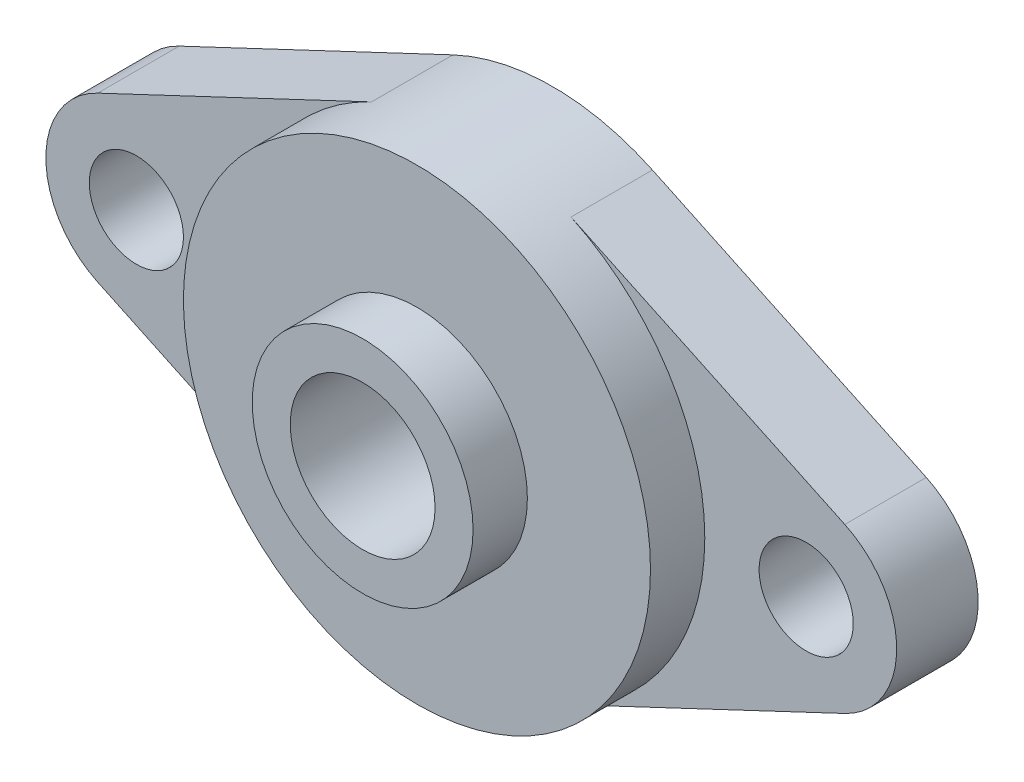
ISO-10303-21;
HEADER;
FILE_DESCRIPTION(('STEP AP214'),'2;1');
FILE_NAME('part.step','',(''),(''),'','','');
FILE_SCHEMA(('AUTOMOTIVE_DESIGN { 1 0 10303 214 1 1 1 1 }'));
ENDSEC;
DATA;
#1=APPLICATION_CONTEXT('core data for automotive mechanical design processes');
#2=APPLICATION_PROTOCOL_DEFINITION('international standard','automotive_design',2000,#1);
#3=PRODUCT_CONTEXT('',#1,'mechanical');
#4=PRODUCT('Part','Part','',(#3));
#5=PRODUCT_RELATED_PRODUCT_CATEGORY('part','',(#4));
#6=PRODUCT_DEFINITION_FORMATION('','',#4);
#7=PRODUCT_DEFINITION_CONTEXT('part definition',#1,'design');
#8=PRODUCT_DEFINITION('design','',#6,#7);
#9=PRODUCT_DEFINITION_SHAPE('','',#8);
#10=(LENGTH_UNIT() NAMED_UNIT(*) SI_UNIT(.MILLI.,.METRE.));
#11=(NAMED_UNIT(*) PLANE_ANGLE_UNIT() SI_UNIT($,.RADIAN.));
#12=(NAMED_UNIT(*) SI_UNIT($,.STERADIAN.) SOLID_ANGLE_UNIT());
#13=UNCERTAINTY_MEASURE_WITH_UNIT(LENGTH_MEASURE(1.E-05),#10,'distance_accuracy_value','');
#14=(GEOMETRIC_REPRESENTATION_CONTEXT(3) GLOBAL_UNCERTAINTY_ASSIGNED_CONTEXT((#13)) GLOBAL_UNIT_ASSIGNED_CONTEXT((#10,
#11,#12)) REPRESENTATION_CONTEXT('',''));
#15=CARTESIAN_POINT('',(0.,0.,0.));
#16=DIRECTION('',(0.,0.,1.));
#17=DIRECTION('',(1.,0.,0.));
#18=AXIS2_PLACEMENT_3D('',#15,#16,#17);
#19=CARTESIAN_POINT('',(0.,0.,4.5));
#20=DIRECTION('',(0.,0.,1.));
#21=DIRECTION('',(1.,0.,0.));
#22=AXIS2_PLACEMENT_3D('',#19,#20,#21);
#23=PLANE('',#22);
#24=CARTESIAN_POINT('',(0.,0.,4.5));
#25=DIRECTION('',(0.,0.,1.));
#26=DIRECTION('',(1.,0.,0.));
#27=AXIS2_PLACEMENT_3D('',#24,#25,#26);
#28=CIRCLE('',#27,12.9);
#29=CARTESIAN_POINT('',(-5.50864864864865,11.6646813100805,4.5));
#30=VERTEX_POINT('',#29);
#31=CARTESIAN_POINT('',(-5.50864864864865,-11.6646813100805,4.5));
#32=VERTEX_POINT('',#31);
#33=EDGE_CURVE('E51',#30,#32,#28,.T.);
#34=ORIENTED_EDGE('',*,*,#33,.F.);
#35=DIRECTION('',(-0.904238861246551,-0.427027027027027,0.));
#36=VECTOR('',#35,1.);
#37=CARTESIAN_POINT('',(-20.6351351351351,4.52119430623275,4.5));
#38=LINE('',#37,#36);
#39=CARTESIAN_POINT('',(-20.6351351351351,4.52119430623275,4.5));
#40=VERTEX_POINT('',#39);
#41=EDGE_CURVE('E163',#30,#40,#38,.T.);
#42=ORIENTED_EDGE('',*,*,#41,.T.);
#43=CARTESIAN_POINT('',(-18.5,0.,4.5));
#44=DIRECTION('',(0.,0.,1.));
#45=DIRECTION('',(1.,0.,0.));
#46=AXIS2_PLACEMENT_3D('',#43,#44,#45);
#47=CIRCLE('',#46,5.);
#48=CARTESIAN_POINT('',(-20.6351351351351,-4.52119430623275,4.5));
#49=VERTEX_POINT('',#48);
#50=EDGE_CURVE('E142',#40,#49,#47,.T.);
#51=ORIENTED_EDGE('',*,*,#50,.T.);
#52=DIRECTION('',(0.904238861246551,-0.427027027027027,0.));
#53=VECTOR('',#52,1.);
#54=CARTESIAN_POINT('',(-20.6351351351351,-4.52119430623275,4.5));
#55=LINE('',#54,#53);
#56=EDGE_CURVE('E139',#49,#32,#55,.T.);
#57=ORIENTED_EDGE('',*,*,#56,.T.);
#58=EDGE_LOOP('',(#34,#42,#51,#57));
#59=FACE_BOUND('',#58,.T.);
#60=CARTESIAN_POINT('',(-18.5,0.,4.5));
#61=DIRECTION('',(0.,0.,1.));
#62=DIRECTION('',(1.,0.,0.));
#63=AXIS2_PLACEMENT_3D('',#60,#61,#62);
#64=CIRCLE('',#63,2.6);
#65=CARTESIAN_POINT('',(-15.9,0.,4.5));
#66=VERTEX_POINT('',#65);
#67=EDGE_CURVE('E197',#66,#66,#64,.T.);
#68=ORIENTED_EDGE('',*,*,#67,.F.);
#69=EDGE_LOOP('',(#68));
#70=FACE_BOUND('',#69,.T.);
#71=ADVANCED_FACE('F41',(#59,#70),#23,.T.);
#72=CARTESIAN_POINT('',(5.50864864864865,-11.6646813100805,4.5));
#73=VERTEX_POINT('',#72);
#74=CARTESIAN_POINT('',(5.50864864864865,11.6646813100805,4.5));
#75=VERTEX_POINT('',#74);
#76=EDGE_CURVE('E115',#73,#75,#28,.T.);
#77=ORIENTED_EDGE('',*,*,#76,.F.);
#78=DIRECTION('',(0.904238861246551,0.427027027027027,0.));
#79=VECTOR('',#78,1.);
#80=CARTESIAN_POINT('',(20.6351351351351,-4.52119430623275,4.5));
#81=LINE('',#80,#79);
#82=CARTESIAN_POINT('',(20.6351351351351,-4.52119430623275,4.5));
#83=VERTEX_POINT('',#82);
#84=EDGE_CURVE('E120',#73,#83,#81,.T.);
#85=ORIENTED_EDGE('',*,*,#84,.T.);
#86=CARTESIAN_POINT('',(18.5,0.,4.5));
#87=DIRECTION('',(0.,0.,1.));
#88=DIRECTION('',(1.,0.,0.));
#89=AXIS2_PLACEMENT_3D('',#86,#87,#88);
#90=CIRCLE('',#89,5.);
#91=CARTESIAN_POINT('',(20.6351351351351,4.52119430623276,4.5));
#92=VERTEX_POINT('',#91);
#93=EDGE_CURVE('E60',#83,#92,#90,.T.);
#94=ORIENTED_EDGE('',*,*,#93,.T.);
#95=DIRECTION('',(-0.904238861246551,0.427027027027027,0.));
#96=VECTOR('',#95,1.);
#97=CARTESIAN_POINT('',(5.50864864864865,11.6646813100805,4.5));
#98=LINE('',#97,#96);
#99=EDGE_CURVE('E123',#92,#75,#98,.T.);
#100=ORIENTED_EDGE('',*,*,#99,.T.);
#101=EDGE_LOOP('',(#77,#85,#94,#100));
#102=FACE_BOUND('',#101,.T.);
#103=CARTESIAN_POINT('',(18.5,0.,4.5));
#104=DIRECTION('',(0.,0.,1.));
#105=DIRECTION('',(1.,0.,0.));
#106=AXIS2_PLACEMENT_3D('',#103,#104,#105);
#107=CIRCLE('',#106,2.6);
#108=CARTESIAN_POINT('',(21.1,0.,4.5));
#109=VERTEX_POINT('',#108);
#110=EDGE_CURVE('E152',#109,#109,#107,.T.);
#111=ORIENTED_EDGE('',*,*,#110,.F.);
#112=EDGE_LOOP('',(#111));
#113=FACE_BOUND('',#112,.T.);
#114=ADVANCED_FACE('F117',(#102,#113),#23,.T.);
#115=CARTESIAN_POINT('',(0.,0.,0.));
#116=DIRECTION('',(0.,0.,1.));
#117=DIRECTION('',(1.,0.,0.));
#118=AXIS2_PLACEMENT_3D('',#115,#116,#117);
#119=PLANE('',#118);
#120=CARTESIAN_POINT('',(0.,0.,0.));
#121=DIRECTION('',(0.,0.,1.));
#122=DIRECTION('',(1.,0.,0.));
#123=AXIS2_PLACEMENT_3D('',#120,#121,#122);
#124=CIRCLE('',#123,4.);
#125=CARTESIAN_POINT('',(4.,0.,0.));
#126=VERTEX_POINT('',#125);
#127=EDGE_CURVE('E214',#126,#126,#124,.T.);
#128=ORIENTED_EDGE('',*,*,#127,.T.);
#129=EDGE_LOOP('',(#128));
#130=FACE_BOUND('',#129,.T.);
#131=CARTESIAN_POINT('',(0.,0.,0.));
#132=DIRECTION('',(0.,0.,1.));
#133=DIRECTION('',(1.,0.,0.));
#134=AXIS2_PLACEMENT_3D('',#131,#132,#133);
#135=CIRCLE('',#134,12.9);
#136=CARTESIAN_POINT('',(5.50864864864865,11.6646813100805,0.));
#137=VERTEX_POINT('',#136);
#138=CARTESIAN_POINT('',(-5.50864864864865,11.6646813100805,0.));
#139=VERTEX_POINT('',#138);
#140=EDGE_CURVE('E148',#137,#139,#135,.T.);
#141=ORIENTED_EDGE('',*,*,#140,.F.);
#142=DIRECTION('',(-0.904238861246551,0.427027027027027,0.));
#143=VECTOR('',#142,1.);
#144=CARTESIAN_POINT('',(5.50864864864865,11.6646813100805,0.));
#145=LINE('',#144,#143);
#146=CARTESIAN_POINT('',(20.6351351351351,4.52119430623276,0.));
#147=VERTEX_POINT('',#146);
#148=EDGE_CURVE('E96',#147,#137,#145,.T.);
#149=ORIENTED_EDGE('',*,*,#148,.F.);
#150=CARTESIAN_POINT('',(18.5,0.,0.));
#151=DIRECTION('',(0.,0.,1.));
#152=DIRECTION('',(1.,0.,0.));
#153=AXIS2_PLACEMENT_3D('',#150,#151,#152);
#154=CIRCLE('',#153,5.);
#155=CARTESIAN_POINT('',(20.6351351351351,-4.52119430623275,0.));
#156=VERTEX_POINT('',#155);
#157=EDGE_CURVE('E89',#156,#147,#154,.T.);
#158=ORIENTED_EDGE('',*,*,#157,.F.);
#159=DIRECTION('',(0.904238861246551,0.427027027027027,0.));
#160=VECTOR('',#159,1.);
#161=CARTESIAN_POINT('',(20.6351351351351,-4.52119430623275,0.));
#162=LINE('',#161,#160);
#163=CARTESIAN_POINT('',(5.50864864864865,-11.6646813100805,0.));
#164=VERTEX_POINT('',#163);
#165=EDGE_CURVE('E159',#164,#156,#162,.T.);
#166=ORIENTED_EDGE('',*,*,#165,.F.);
#167=CARTESIAN_POINT('',(0.,0.,0.));
#168=DIRECTION('',(0.,0.,1.));
#169=DIRECTION('',(1.,0.,0.));
#170=AXIS2_PLACEMENT_3D('',#167,#168,#169);
#171=CIRCLE('',#170,12.9);
#172=CARTESIAN_POINT('',(-5.50864864864865,-11.6646813100805,0.));
#173=VERTEX_POINT('',#172);
#174=EDGE_CURVE('E132',#173,#164,#171,.T.);
#175=ORIENTED_EDGE('',*,*,#174,.F.);
#176=DIRECTION('',(0.904238861246551,-0.427027027027027,0.));
#177=VECTOR('',#176,1.);
#178=CARTESIAN_POINT('',(-20.6351351351351,-4.52119430623275,0.));
#179=LINE('',#178,#177);
#180=CARTESIAN_POINT('',(-20.6351351351351,-4.52119430623275,0.));
#181=VERTEX_POINT('',#180);
#182=EDGE_CURVE('E156',#181,#173,#179,.T.);
#183=ORIENTED_EDGE('',*,*,#182,.F.);
#184=CARTESIAN_POINT('',(-18.5,0.,0.));
#185=DIRECTION('',(0.,0.,1.));
#186=DIRECTION('',(1.,0.,0.));
#187=AXIS2_PLACEMENT_3D('',#184,#185,#186);
#188=CIRCLE('',#187,5.);
#189=CARTESIAN_POINT('',(-20.6351351351351,4.52119430623275,0.));
#190=VERTEX_POINT('',#189);
#191=EDGE_CURVE('E154',#190,#181,#188,.T.);
#192=ORIENTED_EDGE('',*,*,#191,.F.);
#193=DIRECTION('',(-0.904238861246551,-0.427027027027027,0.));
#194=VECTOR('',#193,1.);
#195=CARTESIAN_POINT('',(-20.6351351351351,4.52119430623275,0.));
#196=LINE('',#195,#194);
#197=EDGE_CURVE('E151',#139,#190,#196,.T.);
#198=ORIENTED_EDGE('',*,*,#197,.F.);
#199=EDGE_LOOP('',(#141,#149,#158,#166,#175,#183,#192,#198));
#200=FACE_BOUND('',#199,.T.);
#201=CARTESIAN_POINT('',(18.5,0.,0.));
#202=DIRECTION('',(0.,0.,1.));
#203=DIRECTION('',(1.,0.,0.));
#204=AXIS2_PLACEMENT_3D('',#201,#202,#203);
#205=CIRCLE('',#204,2.6);
#206=CARTESIAN_POINT('',(21.1,0.,0.));
#207=VERTEX_POINT('',#206);
#208=EDGE_CURVE('E194',#207,#207,#205,.T.);
#209=ORIENTED_EDGE('',*,*,#208,.T.);
#210=EDGE_LOOP('',(#209));
#211=FACE_BOUND('',#210,.T.);
#212=CARTESIAN_POINT('',(-18.5,0.,0.));
#213=DIRECTION('',(0.,0.,1.));
#214=DIRECTION('',(1.,0.,0.));
#215=AXIS2_PLACEMENT_3D('',#212,#213,#214);
#216=CIRCLE('',#215,2.6);
#217=CARTESIAN_POINT('',(-15.9,0.,0.));
#218=VERTEX_POINT('',#217);
#219=EDGE_CURVE('E200',#218,#218,#216,.T.);
#220=ORIENTED_EDGE('',*,*,#219,.T.);
#221=EDGE_LOOP('',(#220));
#222=FACE_BOUND('',#221,.T.);
#223=ADVANCED_FACE('F182',(#130,#200,#211,#222),#119,.F.);
#224=CARTESIAN_POINT('',(-20.6351351351351,4.52119430623275,4.5));
#225=DIRECTION('',(0.427027027027027,-0.904238861246551,0.));
#226=DIRECTION('',(0.904238861246551,0.427027027027027,0.));
#227=AXIS2_PLACEMENT_3D('',#224,#225,#226);
#228=PLANE('',#227);
#229=ORIENTED_EDGE('',*,*,#197,.T.);
#230=DIRECTION('',(0.,0.,-1.));
#231=VECTOR('',#230,1.);
#232=CARTESIAN_POINT('',(-20.6351351351351,4.52119430623275,4.5));
#233=LINE('',#232,#231);
#234=EDGE_CURVE('E171',#40,#190,#233,.T.);
#235=ORIENTED_EDGE('',*,*,#234,.F.);
#236=ORIENTED_EDGE('',*,*,#41,.F.);
#237=DIRECTION('',(0.,0.,-1.));
#238=VECTOR('',#237,1.);
#239=CARTESIAN_POINT('',(-5.50864864864865,11.6646813100805,4.5));
#240=LINE('',#239,#238);
#241=EDGE_CURVE('E45',#30,#139,#240,.T.);
#242=ORIENTED_EDGE('',*,*,#241,.T.);
#243=EDGE_LOOP('',(#229,#235,#236,#242));
#244=FACE_BOUND('',#243,.T.);
#245=ADVANCED_FACE('F43',(#244),#228,.F.);
#246=CARTESIAN_POINT('',(-18.5,0.,4.5));
#247=DIRECTION('',(0.,0.,-1.));
#248=DIRECTION('',(-1.,0.,0.));
#249=AXIS2_PLACEMENT_3D('',#246,#247,#248);
#250=CYLINDRICAL_SURFACE('',#249,5.);
#251=ORIENTED_EDGE('',*,*,#191,.T.);
#252=DIRECTION('',(0.,0.,-1.));
#253=VECTOR('',#252,1.);
#254=CARTESIAN_POINT('',(-20.6351351351351,-4.52119430623275,4.5));
#255=LINE('',#254,#253);
#256=EDGE_CURVE('E169',#49,#181,#255,.T.);
#257=ORIENTED_EDGE('',*,*,#256,.F.);
#258=ORIENTED_EDGE('',*,*,#50,.F.);
#259=ORIENTED_EDGE('',*,*,#234,.T.);
#260=EDGE_LOOP('',(#251,#257,#258,#259));
#261=FACE_BOUND('',#260,.T.);
#262=ADVANCED_FACE('F186',(#261),#250,.T.);
#263=CARTESIAN_POINT('',(-20.6351351351351,-4.52119430623275,4.5));
#264=DIRECTION('',(0.427027027027027,0.904238861246551,0.));
#265=DIRECTION('',(-0.904238861246551,0.427027027027027,0.));
#266=AXIS2_PLACEMENT_3D('',#263,#264,#265);
#267=PLANE('',#266);
#268=ORIENTED_EDGE('',*,*,#182,.T.);
#269=DIRECTION('',(0.,0.,-1.));
#270=VECTOR('',#269,1.);
#271=CARTESIAN_POINT('',(-5.50864864864865,-11.6646813100805,4.5));
#272=LINE('',#271,#270);
#273=EDGE_CURVE('E135',#32,#173,#272,.T.);
#274=ORIENTED_EDGE('',*,*,#273,.F.);
#275=ORIENTED_EDGE('',*,*,#56,.F.);
#276=ORIENTED_EDGE('',*,*,#256,.T.);
#277=EDGE_LOOP('',(#268,#274,#275,#276));
#278=FACE_BOUND('',#277,.T.);
#279=ADVANCED_FACE('F189',(#278),#267,.F.);
#280=CARTESIAN_POINT('',(0.,0.,4.5));
#281=DIRECTION('',(0.,0.,-1.));
#282=DIRECTION('',(-1.,0.,0.));
#283=AXIS2_PLACEMENT_3D('',#280,#281,#282);
#284=CYLINDRICAL_SURFACE('',#283,12.9);
#285=ORIENTED_EDGE('',*,*,#174,.T.);
#286=DIRECTION('',(0.,0.,-1.));
#287=VECTOR('',#286,1.);
#288=CARTESIAN_POINT('',(5.50864864864865,-11.6646813100805,4.5));
#289=LINE('',#288,#287);
#290=EDGE_CURVE('E127',#73,#164,#289,.T.);
#291=ORIENTED_EDGE('',*,*,#290,.F.);
#292=ORIENTED_EDGE('',*,*,#76,.T.);
#293=DIRECTION('',(0.,0.,-1.));
#294=VECTOR('',#293,1.);
#295=CARTESIAN_POINT('',(5.50864864864865,11.6646813100805,4.5));
#296=LINE('',#295,#294);
#297=EDGE_CURVE('E147',#75,#137,#296,.T.);
#298=ORIENTED_EDGE('',*,*,#297,.T.);
#299=ORIENTED_EDGE('',*,*,#140,.T.);
#300=ORIENTED_EDGE('',*,*,#241,.F.);
#301=ORIENTED_EDGE('',*,*,#33,.T.);
#302=ORIENTED_EDGE('',*,*,#273,.T.);
#303=EDGE_LOOP('',(#285,#291,#292,#298,#299,#300,#301,#302));
#304=FACE_BOUND('',#303,.T.);
#305=CARTESIAN_POINT('',(0.,0.,7.5));
#306=DIRECTION('',(0.,0.,1.));
#307=DIRECTION('',(1.,0.,0.));
#308=AXIS2_PLACEMENT_3D('',#305,#306,#307);
#309=CIRCLE('',#308,12.9);
#310=CARTESIAN_POINT('',(12.9,0.,7.5));
#311=VERTEX_POINT('',#310);
#312=EDGE_CURVE('E203',#311,#311,#309,.T.);
#313=ORIENTED_EDGE('',*,*,#312,.F.);
#314=EDGE_LOOP('',(#313));
#315=FACE_BOUND('',#314,.T.);
#316=ADVANCED_FACE('F128',(#304,#315),#284,.T.);
#317=CARTESIAN_POINT('',(20.6351351351351,-4.52119430623275,4.5));
#318=DIRECTION('',(-0.427027027027027,0.904238861246551,0.));
#319=DIRECTION('',(-0.904238861246551,-0.427027027027027,0.));
#320=AXIS2_PLACEMENT_3D('',#317,#318,#319);
#321=PLANE('',#320);
#322=ORIENTED_EDGE('',*,*,#165,.T.);
#323=DIRECTION('',(0.,0.,-1.));
#324=VECTOR('',#323,1.);
#325=CARTESIAN_POINT('',(20.6351351351351,-4.52119430623275,4.5));
#326=LINE('',#325,#324);
#327=EDGE_CURVE('E136',#83,#156,#326,.T.);
#328=ORIENTED_EDGE('',*,*,#327,.F.);
#329=ORIENTED_EDGE('',*,*,#84,.F.);
#330=ORIENTED_EDGE('',*,*,#290,.T.);
#331=EDGE_LOOP('',(#322,#328,#329,#330));
#332=FACE_BOUND('',#331,.T.);
#333=ADVANCED_FACE('F138',(#332),#321,.F.);
#334=CARTESIAN_POINT('',(18.5,0.,4.5));
#335=DIRECTION('',(0.,0.,-1.));
#336=DIRECTION('',(-1.,0.,0.));
#337=AXIS2_PLACEMENT_3D('',#334,#335,#336);
#338=CYLINDRICAL_SURFACE('',#337,5.);
#339=ORIENTED_EDGE('',*,*,#157,.T.);
#340=DIRECTION('',(0.,0.,-1.));
#341=VECTOR('',#340,1.);
#342=CARTESIAN_POINT('',(20.6351351351351,4.52119430623276,4.5));
#343=LINE('',#342,#341);
#344=EDGE_CURVE('E165',#92,#147,#343,.T.);
#345=ORIENTED_EDGE('',*,*,#344,.F.);
#346=ORIENTED_EDGE('',*,*,#93,.F.);
#347=ORIENTED_EDGE('',*,*,#327,.T.);
#348=EDGE_LOOP('',(#339,#345,#346,#347));
#349=FACE_BOUND('',#348,.T.);
#350=ADVANCED_FACE('F249',(#349),#338,.T.);
#351=CARTESIAN_POINT('',(5.50864864864865,11.6646813100805,4.5));
#352=DIRECTION('',(-0.427027027027027,-0.904238861246551,0.));
#353=DIRECTION('',(0.904238861246551,-0.427027027027027,0.));
#354=AXIS2_PLACEMENT_3D('',#351,#352,#353);
#355=PLANE('',#354);
#356=ORIENTED_EDGE('',*,*,#148,.T.);
#357=ORIENTED_EDGE('',*,*,#297,.F.);
#358=ORIENTED_EDGE('',*,*,#99,.F.);
#359=ORIENTED_EDGE('',*,*,#344,.T.);
#360=EDGE_LOOP('',(#356,#357,#358,#359));
#361=FACE_BOUND('',#360,.T.);
#362=ADVANCED_FACE('F263',(#361),#355,.F.);
#363=CARTESIAN_POINT('',(18.5,0.,4.5));
#364=DIRECTION('',(0.,0.,-1.));
#365=DIRECTION('',(-1.,0.,0.));
#366=AXIS2_PLACEMENT_3D('',#363,#364,#365);
#367=CYLINDRICAL_SURFACE('',#366,2.6);
#368=ORIENTED_EDGE('',*,*,#110,.T.);
#369=EDGE_LOOP('',(#368));
#370=FACE_BOUND('',#369,.T.);
#371=ORIENTED_EDGE('',*,*,#208,.F.);
#372=EDGE_LOOP('',(#371));
#373=FACE_BOUND('',#372,.T.);
#374=ADVANCED_FACE('F259',(#370,#373),#367,.F.);
#375=CARTESIAN_POINT('',(-18.5,0.,4.5));
#376=DIRECTION('',(0.,0.,-1.));
#377=DIRECTION('',(-1.,0.,0.));
#378=AXIS2_PLACEMENT_3D('',#375,#376,#377);
#379=CYLINDRICAL_SURFACE('',#378,2.6);
#380=ORIENTED_EDGE('',*,*,#67,.T.);
#381=EDGE_LOOP('',(#380));
#382=FACE_BOUND('',#381,.T.);
#383=ORIENTED_EDGE('',*,*,#219,.F.);
#384=EDGE_LOOP('',(#383));
#385=FACE_BOUND('',#384,.T.);
#386=ADVANCED_FACE('F240',(#382,#385),#379,.F.);
#387=CARTESIAN_POINT('',(0.,0.,7.5));
#388=DIRECTION('',(0.,0.,1.));
#389=DIRECTION('',(1.,0.,0.));
#390=AXIS2_PLACEMENT_3D('',#387,#388,#389);
#391=PLANE('',#390);
#392=CARTESIAN_POINT('',(0.,0.,7.5));
#393=DIRECTION('',(0.,0.,1.));
#394=DIRECTION('',(1.,0.,0.));
#395=AXIS2_PLACEMENT_3D('',#392,#393,#394);
#396=CIRCLE('',#395,6.1);
#397=CARTESIAN_POINT('',(6.1,0.,7.5));
#398=VERTEX_POINT('',#397);
#399=EDGE_CURVE('E11',#398,#398,#396,.T.);
#400=ORIENTED_EDGE('',*,*,#399,.F.);
#401=EDGE_LOOP('',(#400));
#402=FACE_BOUND('',#401,.T.);
#403=ORIENTED_EDGE('',*,*,#312,.T.);
#404=EDGE_LOOP('',(#403));
#405=FACE_BOUND('',#404,.T.);
#406=ADVANCED_FACE('F234',(#402,#405),#391,.T.);
#407=CARTESIAN_POINT('',(0.,0.,10.5));
#408=DIRECTION('',(0.,0.,-1.));
#409=DIRECTION('',(-1.,0.,0.));
#410=AXIS2_PLACEMENT_3D('',#407,#408,#409);
#411=CYLINDRICAL_SURFACE('',#410,6.1);
#412=CARTESIAN_POINT('',(0.,0.,10.5));
#413=DIRECTION('',(0.,0.,1.));
#414=DIRECTION('',(1.,0.,0.));
#415=AXIS2_PLACEMENT_3D('',#412,#413,#414);
#416=CIRCLE('',#415,6.1);
#417=CARTESIAN_POINT('',(6.1,0.,10.5));
#418=VERTEX_POINT('',#417);
#419=EDGE_CURVE('E207',#418,#418,#416,.T.);
#420=ORIENTED_EDGE('',*,*,#419,.F.);
#421=EDGE_LOOP('',(#420));
#422=FACE_BOUND('',#421,.T.);
#423=ORIENTED_EDGE('',*,*,#399,.T.);
#424=EDGE_LOOP('',(#423));
#425=FACE_BOUND('',#424,.T.);
#426=ADVANCED_FACE('F228',(#422,#425),#411,.T.);
#427=CARTESIAN_POINT('',(0.,0.,10.5));
#428=DIRECTION('',(0.,0.,1.));
#429=DIRECTION('',(1.,0.,0.));
#430=AXIS2_PLACEMENT_3D('',#427,#428,#429);
#431=PLANE('',#430);
#432=CARTESIAN_POINT('',(0.,0.,10.5));
#433=DIRECTION('',(0.,0.,1.));
#434=DIRECTION('',(1.,0.,0.));
#435=AXIS2_PLACEMENT_3D('',#432,#433,#434);
#436=CIRCLE('',#435,4.);
#437=CARTESIAN_POINT('',(4.,0.,10.5));
#438=VERTEX_POINT('',#437);
#439=EDGE_CURVE('E211',#438,#438,#436,.T.);
#440=ORIENTED_EDGE('',*,*,#439,.F.);
#441=EDGE_LOOP('',(#440));
#442=FACE_BOUND('',#441,.T.);
#443=ORIENTED_EDGE('',*,*,#419,.T.);
#444=EDGE_LOOP('',(#443));
#445=FACE_BOUND('',#444,.T.);
#446=ADVANCED_FACE('F222',(#442,#445),#431,.T.);
#447=CARTESIAN_POINT('',(0.,0.,21.8137084989848));
#448=DIRECTION('',(0.,0.,-1.));
#449=DIRECTION('',(-1.,0.,0.));
#450=AXIS2_PLACEMENT_3D('',#447,#448,#449);
#451=CYLINDRICAL_SURFACE('',#450,4.);
#452=ORIENTED_EDGE('',*,*,#127,.F.);
#453=EDGE_LOOP('',(#452));
#454=FACE_BOUND('',#453,.T.);
#455=ORIENTED_EDGE('',*,*,#439,.T.);
#456=EDGE_LOOP('',(#455));
#457=FACE_BOUND('',#456,.T.);
#458=ADVANCED_FACE('F219',(#454,#457),#451,.F.);
#459=CLOSED_SHELL('',(#71,#114,#223,#245,#262,#279,#316,#333,#350,#362,#374,#386,#406,#426,#446,#458));
#460=MANIFOLD_SOLID_BREP('B2',#459);
#461=ADVANCED_BREP_SHAPE_REPRESENTATION('',(#18,#460),#14);
#462=SHAPE_DEFINITION_REPRESENTATION(#9,#461);
ENDSEC;
END-ISO-10303-21;
